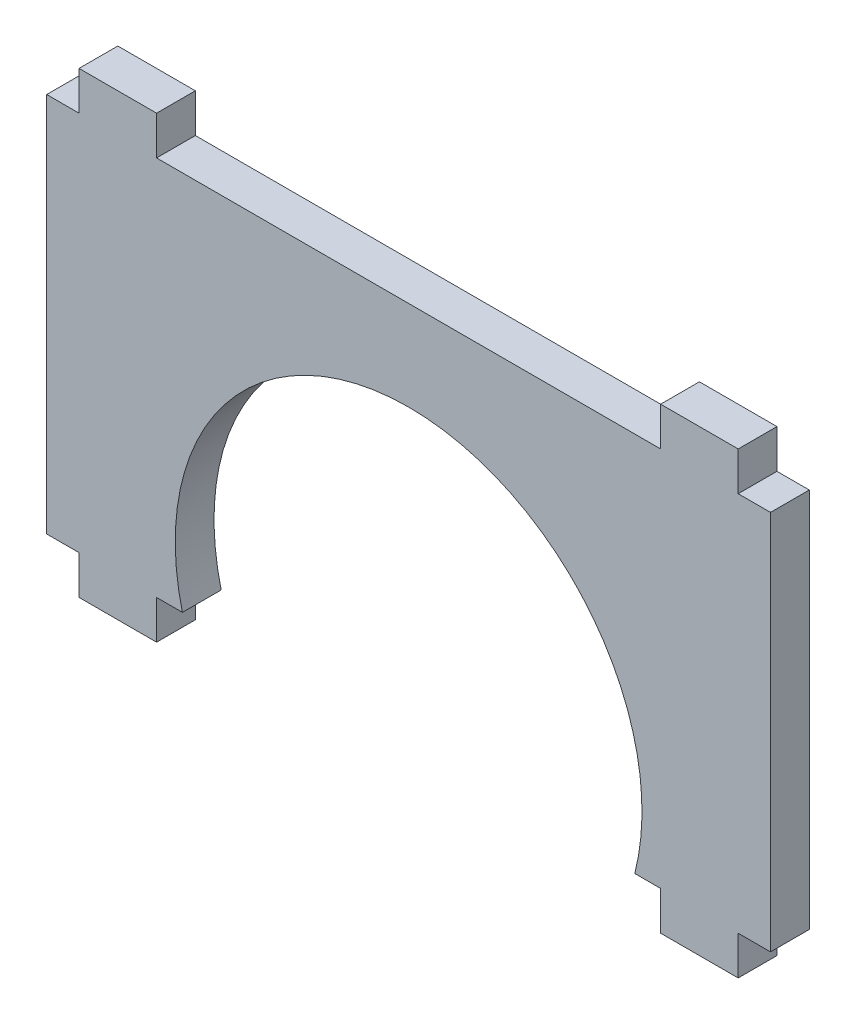
ISO-10303-21;
HEADER;
FILE_DESCRIPTION(('STEP AP214'),'2;1');
FILE_NAME('part.step','',(''),(''),'','','');
FILE_SCHEMA(('AUTOMOTIVE_DESIGN { 1 0 10303 214 1 1 1 1 }'));
ENDSEC;
DATA;
#1=APPLICATION_CONTEXT('core data for automotive mechanical design processes');
#2=APPLICATION_PROTOCOL_DEFINITION('international standard','automotive_design',2000,#1);
#3=PRODUCT_CONTEXT('',#1,'mechanical');
#4=PRODUCT('Part','Part','',(#3));
#5=PRODUCT_RELATED_PRODUCT_CATEGORY('part','',(#4));
#6=PRODUCT_DEFINITION_FORMATION('','',#4);
#7=PRODUCT_DEFINITION_CONTEXT('part definition',#1,'design');
#8=PRODUCT_DEFINITION('design','',#6,#7);
#9=PRODUCT_DEFINITION_SHAPE('','',#8);
#10=(LENGTH_UNIT() NAMED_UNIT(*) SI_UNIT(.MILLI.,.METRE.));
#11=(NAMED_UNIT(*) PLANE_ANGLE_UNIT() SI_UNIT($,.RADIAN.));
#12=(NAMED_UNIT(*) SI_UNIT($,.STERADIAN.) SOLID_ANGLE_UNIT());
#13=UNCERTAINTY_MEASURE_WITH_UNIT(LENGTH_MEASURE(1.E-05),#10,'distance_accuracy_value','');
#14=(GEOMETRIC_REPRESENTATION_CONTEXT(3) GLOBAL_UNCERTAINTY_ASSIGNED_CONTEXT((#13)) GLOBAL_UNIT_ASSIGNED_CONTEXT((#10,
#11,#12)) REPRESENTATION_CONTEXT('',''));
#15=CARTESIAN_POINT('',(0.,0.,0.));
#16=DIRECTION('',(0.,0.,1.));
#17=DIRECTION('',(1.,0.,0.));
#18=AXIS2_PLACEMENT_3D('',#15,#16,#17);
#19=CARTESIAN_POINT('',(0.,-14.725,3.));
#20=DIRECTION('',(0.,1.,0.));
#21=DIRECTION('',(-1.,0.,0.));
#22=AXIS2_PLACEMENT_3D('',#19,#20,#21);
#23=PLANE('',#22);
#24=DIRECTION('',(1.,0.,0.));
#25=VECTOR('',#24,1.);
#26=CARTESIAN_POINT('',(0.,-14.725,0.));
#27=LINE('',#26,#25);
#28=CARTESIAN_POINT('',(-28.,-14.725,0.));
#29=VERTEX_POINT('',#28);
#30=CARTESIAN_POINT('',(-25.5,-14.725,0.));
#31=VERTEX_POINT('',#30);
#32=EDGE_CURVE('E339',#29,#31,#27,.T.);
#33=ORIENTED_EDGE('',*,*,#32,.T.);
#34=DIRECTION('',(0.,0.,-1.));
#35=VECTOR('',#34,1.);
#36=CARTESIAN_POINT('',(-25.5,-14.725,3.));
#37=LINE('',#36,#35);
#38=CARTESIAN_POINT('',(-25.5,-14.725,3.));
#39=VERTEX_POINT('',#38);
#40=EDGE_CURVE('E11',#39,#31,#37,.T.);
#41=ORIENTED_EDGE('',*,*,#40,.F.);
#42=DIRECTION('',(1.,0.,0.));
#43=VECTOR('',#42,1.);
#44=CARTESIAN_POINT('',(0.,-14.725,3.));
#45=LINE('',#44,#43);
#46=CARTESIAN_POINT('',(-28.,-14.725,3.));
#47=VERTEX_POINT('',#46);
#48=EDGE_CURVE('E261',#47,#39,#45,.T.);
#49=ORIENTED_EDGE('',*,*,#48,.F.);
#50=DIRECTION('',(0.,0.,-1.));
#51=VECTOR('',#50,1.);
#52=CARTESIAN_POINT('',(-28.,-14.725,3.));
#53=LINE('',#52,#51);
#54=EDGE_CURVE('E58',#47,#29,#53,.T.);
#55=ORIENTED_EDGE('',*,*,#54,.T.);
#56=EDGE_LOOP('',(#33,#41,#49,#55));
#57=FACE_BOUND('',#56,.T.);
#58=ADVANCED_FACE('F41',(#57),#23,.F.);
#59=CARTESIAN_POINT('',(-25.5,0.,3.));
#60=DIRECTION('',(1.,0.,0.));
#61=DIRECTION('',(0.,1.,0.));
#62=AXIS2_PLACEMENT_3D('',#59,#60,#61);
#63=PLANE('',#62);
#64=DIRECTION('',(0.,-1.,0.));
#65=VECTOR('',#64,1.);
#66=CARTESIAN_POINT('',(-25.5,0.,0.));
#67=LINE('',#66,#65);
#68=CARTESIAN_POINT('',(-25.5,-17.725,0.));
#69=VERTEX_POINT('',#68);
#70=EDGE_CURVE('E334',#31,#69,#67,.T.);
#71=ORIENTED_EDGE('',*,*,#70,.T.);
#72=DIRECTION('',(0.,0.,-1.));
#73=VECTOR('',#72,1.);
#74=CARTESIAN_POINT('',(-25.5,-17.725,3.));
#75=LINE('',#74,#73);
#76=CARTESIAN_POINT('',(-25.5,-17.725,3.));
#77=VERTEX_POINT('',#76);
#78=EDGE_CURVE('E50',#77,#69,#75,.T.);
#79=ORIENTED_EDGE('',*,*,#78,.F.);
#80=DIRECTION('',(0.,-1.,0.));
#81=VECTOR('',#80,1.);
#82=CARTESIAN_POINT('',(-25.5,0.,3.));
#83=LINE('',#82,#81);
#84=EDGE_CURVE('E138',#39,#77,#83,.T.);
#85=ORIENTED_EDGE('',*,*,#84,.F.);
#86=ORIENTED_EDGE('',*,*,#40,.T.);
#87=EDGE_LOOP('',(#71,#79,#85,#86));
#88=FACE_BOUND('',#87,.T.);
#89=ADVANCED_FACE('F43',(#88),#63,.F.);
#90=CARTESIAN_POINT('',(0.,-17.725,3.));
#91=DIRECTION('',(0.,1.,0.));
#92=DIRECTION('',(-1.,0.,0.));
#93=AXIS2_PLACEMENT_3D('',#90,#91,#92);
#94=PLANE('',#93);
#95=DIRECTION('',(1.,0.,0.));
#96=VECTOR('',#95,1.);
#97=CARTESIAN_POINT('',(0.,-17.725,0.));
#98=LINE('',#97,#96);
#99=CARTESIAN_POINT('',(-19.5,-17.725,0.));
#100=VERTEX_POINT('',#99);
#101=EDGE_CURVE('E330',#69,#100,#98,.T.);
#102=ORIENTED_EDGE('',*,*,#101,.T.);
#103=DIRECTION('',(0.,0.,-1.));
#104=VECTOR('',#103,1.);
#105=CARTESIAN_POINT('',(-19.5,-17.725,3.));
#106=LINE('',#105,#104);
#107=CARTESIAN_POINT('',(-19.5,-17.725,3.));
#108=VERTEX_POINT('',#107);
#109=EDGE_CURVE('E322',#108,#100,#106,.T.);
#110=ORIENTED_EDGE('',*,*,#109,.F.);
#111=DIRECTION('',(1.,0.,0.));
#112=VECTOR('',#111,1.);
#113=CARTESIAN_POINT('',(0.,-17.725,3.));
#114=LINE('',#113,#112);
#115=EDGE_CURVE('E258',#77,#108,#114,.T.);
#116=ORIENTED_EDGE('',*,*,#115,.F.);
#117=ORIENTED_EDGE('',*,*,#78,.T.);
#118=EDGE_LOOP('',(#102,#110,#116,#117));
#119=FACE_BOUND('',#118,.T.);
#120=ADVANCED_FACE('F328',(#119),#94,.F.);
#121=CARTESIAN_POINT('',(-19.5,0.,3.));
#122=DIRECTION('',(1.,0.,0.));
#123=DIRECTION('',(0.,0.,-1.));
#124=AXIS2_PLACEMENT_3D('',#121,#122,#123);
#125=PLANE('',#124);
#126=DIRECTION('',(0.,-1.,0.));
#127=VECTOR('',#126,1.);
#128=CARTESIAN_POINT('',(-19.5,0.,0.));
#129=LINE('',#128,#127);
#130=CARTESIAN_POINT('',(-19.5,-14.725,0.));
#131=VERTEX_POINT('',#130);
#132=EDGE_CURVE('E336',#131,#100,#129,.T.);
#133=ORIENTED_EDGE('',*,*,#132,.F.);
#134=DIRECTION('',(0.,0.,-1.));
#135=VECTOR('',#134,1.);
#136=CARTESIAN_POINT('',(-19.5,-14.725,3.));
#137=LINE('',#136,#135);
#138=CARTESIAN_POINT('',(-19.5,-14.725,3.));
#139=VERTEX_POINT('',#138);
#140=EDGE_CURVE('E280',#139,#131,#137,.T.);
#141=ORIENTED_EDGE('',*,*,#140,.F.);
#142=DIRECTION('',(0.,-1.,0.));
#143=VECTOR('',#142,1.);
#144=CARTESIAN_POINT('',(-19.5,0.,3.));
#145=LINE('',#144,#143);
#146=EDGE_CURVE('E255',#139,#108,#145,.T.);
#147=ORIENTED_EDGE('',*,*,#146,.T.);
#148=ORIENTED_EDGE('',*,*,#109,.T.);
#149=EDGE_LOOP('',(#133,#141,#147,#148));
#150=FACE_BOUND('',#149,.T.);
#151=ADVANCED_FACE('F413',(#150),#125,.T.);
#152=CARTESIAN_POINT('',(-17.5,-14.725,0.));
#153=VERTEX_POINT('',#152);
#154=EDGE_CURVE('E277',#131,#153,#27,.T.);
#155=ORIENTED_EDGE('',*,*,#154,.T.);
#156=DIRECTION('',(0.,0.,-1.));
#157=VECTOR('',#156,1.);
#158=CARTESIAN_POINT('',(-17.5,-14.725,3.));
#159=LINE('',#158,#157);
#160=CARTESIAN_POINT('',(-17.5,-14.725,3.));
#161=VERTEX_POINT('',#160);
#162=EDGE_CURVE('E274',#161,#153,#159,.T.);
#163=ORIENTED_EDGE('',*,*,#162,.F.);
#164=EDGE_CURVE('E254',#139,#161,#45,.T.);
#165=ORIENTED_EDGE('',*,*,#164,.F.);
#166=ORIENTED_EDGE('',*,*,#140,.T.);
#167=EDGE_LOOP('',(#155,#163,#165,#166));
#168=FACE_BOUND('',#167,.T.);
#169=ADVANCED_FACE('F275',(#168),#23,.F.);
#170=CARTESIAN_POINT('',(0.,-10.275,3.));
#171=DIRECTION('',(0.,0.,-1.));
#172=DIRECTION('',(-1.,0.,0.));
#173=AXIS2_PLACEMENT_3D('',#170,#171,#172);
#174=CYLINDRICAL_SURFACE('',#173,18.0569238797753);
#175=CARTESIAN_POINT('',(0.,-10.275,0.));
#176=DIRECTION('',(0.,0.,1.));
#177=DIRECTION('',(1.,0.,0.));
#178=AXIS2_PLACEMENT_3D('',#175,#176,#177);
#179=CIRCLE('',#178,18.0569238797753);
#180=CARTESIAN_POINT('',(17.5,-14.725,0.));
#181=VERTEX_POINT('',#180);
#182=EDGE_CURVE('E286',#153,#181,#179,.F.);
#183=ORIENTED_EDGE('',*,*,#182,.T.);
#184=DIRECTION('',(0.,0.,-1.));
#185=VECTOR('',#184,1.);
#186=CARTESIAN_POINT('',(17.5,-14.725,3.));
#187=LINE('',#186,#185);
#188=CARTESIAN_POINT('',(17.5,-14.725,3.));
#189=VERTEX_POINT('',#188);
#190=EDGE_CURVE('E281',#189,#181,#187,.T.);
#191=ORIENTED_EDGE('',*,*,#190,.F.);
#192=CARTESIAN_POINT('',(0.,-10.275,3.));
#193=DIRECTION('',(0.,0.,1.));
#194=DIRECTION('',(1.,0.,0.));
#195=AXIS2_PLACEMENT_3D('',#192,#193,#194);
#196=CIRCLE('',#195,18.0569238797753);
#197=EDGE_CURVE('E252',#161,#189,#196,.F.);
#198=ORIENTED_EDGE('',*,*,#197,.F.);
#199=ORIENTED_EDGE('',*,*,#162,.T.);
#200=EDGE_LOOP('',(#183,#191,#198,#199));
#201=FACE_BOUND('',#200,.T.);
#202=ADVANCED_FACE('F283',(#201),#174,.F.);
#203=CARTESIAN_POINT('',(0.,-14.725,3.));
#204=DIRECTION('',(0.,1.,0.));
#205=DIRECTION('',(-1.,0.,0.));
#206=AXIS2_PLACEMENT_3D('',#203,#204,#205);
#207=PLANE('',#206);
#208=DIRECTION('',(1.,0.,0.));
#209=VECTOR('',#208,1.);
#210=CARTESIAN_POINT('',(0.,-14.725,0.));
#211=LINE('',#210,#209);
#212=CARTESIAN_POINT('',(19.5,-14.725,0.));
#213=VERTEX_POINT('',#212);
#214=EDGE_CURVE('E344',#181,#213,#211,.T.);
#215=ORIENTED_EDGE('',*,*,#214,.T.);
#216=DIRECTION('',(0.,0.,-1.));
#217=VECTOR('',#216,1.);
#218=CARTESIAN_POINT('',(19.5,-14.725,3.));
#219=LINE('',#218,#217);
#220=CARTESIAN_POINT('',(19.5,-14.725,3.));
#221=VERTEX_POINT('',#220);
#222=EDGE_CURVE('E289',#221,#213,#219,.T.);
#223=ORIENTED_EDGE('',*,*,#222,.F.);
#224=DIRECTION('',(1.,0.,0.));
#225=VECTOR('',#224,1.);
#226=CARTESIAN_POINT('',(0.,-14.725,3.));
#227=LINE('',#226,#225);
#228=EDGE_CURVE('E250',#189,#221,#227,.T.);
#229=ORIENTED_EDGE('',*,*,#228,.F.);
#230=ORIENTED_EDGE('',*,*,#190,.T.);
#231=EDGE_LOOP('',(#215,#223,#229,#230));
#232=FACE_BOUND('',#231,.T.);
#233=ADVANCED_FACE('F292',(#232),#207,.F.);
#234=CARTESIAN_POINT('',(19.5,0.,3.));
#235=DIRECTION('',(1.,0.,0.));
#236=DIRECTION('',(0.,0.,-1.));
#237=AXIS2_PLACEMENT_3D('',#234,#235,#236);
#238=PLANE('',#237);
#239=DIRECTION('',(0.,-1.,0.));
#240=VECTOR('',#239,1.);
#241=CARTESIAN_POINT('',(19.5,0.,0.));
#242=LINE('',#241,#240);
#243=CARTESIAN_POINT('',(19.5,-17.725,0.));
#244=VERTEX_POINT('',#243);
#245=EDGE_CURVE('E303',#213,#244,#242,.T.);
#246=ORIENTED_EDGE('',*,*,#245,.T.);
#247=DIRECTION('',(0.,0.,-1.));
#248=VECTOR('',#247,1.);
#249=CARTESIAN_POINT('',(19.5,-17.725,3.));
#250=LINE('',#249,#248);
#251=CARTESIAN_POINT('',(19.5,-17.725,3.));
#252=VERTEX_POINT('',#251);
#253=EDGE_CURVE('E300',#252,#244,#250,.T.);
#254=ORIENTED_EDGE('',*,*,#253,.F.);
#255=DIRECTION('',(0.,-1.,0.));
#256=VECTOR('',#255,1.);
#257=CARTESIAN_POINT('',(19.5,0.,3.));
#258=LINE('',#257,#256);
#259=EDGE_CURVE('E248',#221,#252,#258,.T.);
#260=ORIENTED_EDGE('',*,*,#259,.F.);
#261=ORIENTED_EDGE('',*,*,#222,.T.);
#262=EDGE_LOOP('',(#246,#254,#260,#261));
#263=FACE_BOUND('',#262,.T.);
#264=ADVANCED_FACE('F301',(#263),#238,.F.);
#265=CARTESIAN_POINT('',(0.,-17.725,3.));
#266=DIRECTION('',(0.,-1.,0.));
#267=DIRECTION('',(1.,0.,0.));
#268=AXIS2_PLACEMENT_3D('',#265,#266,#267);
#269=PLANE('',#268);
#270=DIRECTION('',(-1.,0.,0.));
#271=VECTOR('',#270,1.);
#272=CARTESIAN_POINT('',(0.,-17.725,0.));
#273=LINE('',#272,#271);
#274=CARTESIAN_POINT('',(25.5,-17.725,0.));
#275=VERTEX_POINT('',#274);
#276=EDGE_CURVE('E310',#275,#244,#273,.T.);
#277=ORIENTED_EDGE('',*,*,#276,.F.);
#278=DIRECTION('',(0.,0.,-1.));
#279=VECTOR('',#278,1.);
#280=CARTESIAN_POINT('',(25.5,-17.725,3.));
#281=LINE('',#280,#279);
#282=CARTESIAN_POINT('',(25.5,-17.725,3.));
#283=VERTEX_POINT('',#282);
#284=EDGE_CURVE('E307',#283,#275,#281,.T.);
#285=ORIENTED_EDGE('',*,*,#284,.F.);
#286=DIRECTION('',(-1.,0.,0.));
#287=VECTOR('',#286,1.);
#288=CARTESIAN_POINT('',(0.,-17.725,3.));
#289=LINE('',#288,#287);
#290=EDGE_CURVE('E245',#283,#252,#289,.T.);
#291=ORIENTED_EDGE('',*,*,#290,.T.);
#292=ORIENTED_EDGE('',*,*,#253,.T.);
#293=EDGE_LOOP('',(#277,#285,#291,#292));
#294=FACE_BOUND('',#293,.T.);
#295=ADVANCED_FACE('F309',(#294),#269,.T.);
#296=CARTESIAN_POINT('',(25.5,0.,3.));
#297=DIRECTION('',(1.,0.,0.));
#298=DIRECTION('',(0.,1.,0.));
#299=AXIS2_PLACEMENT_3D('',#296,#297,#298);
#300=PLANE('',#299);
#301=DIRECTION('',(0.,-1.,0.));
#302=VECTOR('',#301,1.);
#303=CARTESIAN_POINT('',(25.5,0.,0.));
#304=LINE('',#303,#302);
#305=CARTESIAN_POINT('',(25.5,-14.725,0.));
#306=VERTEX_POINT('',#305);
#307=EDGE_CURVE('E349',#306,#275,#304,.T.);
#308=ORIENTED_EDGE('',*,*,#307,.F.);
#309=DIRECTION('',(0.,0.,-1.));
#310=VECTOR('',#309,1.);
#311=CARTESIAN_POINT('',(25.5,-14.725,3.));
#312=LINE('',#311,#310);
#313=CARTESIAN_POINT('',(25.5,-14.725,3.));
#314=VERTEX_POINT('',#313);
#315=EDGE_CURVE('E314',#314,#306,#312,.T.);
#316=ORIENTED_EDGE('',*,*,#315,.F.);
#317=DIRECTION('',(0.,-1.,0.));
#318=VECTOR('',#317,1.);
#319=CARTESIAN_POINT('',(25.5,0.,3.));
#320=LINE('',#319,#318);
#321=EDGE_CURVE('E242',#314,#283,#320,.T.);
#322=ORIENTED_EDGE('',*,*,#321,.T.);
#323=ORIENTED_EDGE('',*,*,#284,.T.);
#324=EDGE_LOOP('',(#308,#316,#322,#323));
#325=FACE_BOUND('',#324,.T.);
#326=ADVANCED_FACE('F411',(#325),#300,.T.);
#327=CARTESIAN_POINT('',(28.,-14.725,0.));
#328=VERTEX_POINT('',#327);
#329=EDGE_CURVE('E346',#306,#328,#211,.T.);
#330=ORIENTED_EDGE('',*,*,#329,.T.);
#331=DIRECTION('',(0.,0.,-1.));
#332=VECTOR('',#331,1.);
#333=CARTESIAN_POINT('',(28.,-14.725,3.));
#334=LINE('',#333,#332);
#335=CARTESIAN_POINT('',(28.,-14.725,3.));
#336=VERTEX_POINT('',#335);
#337=EDGE_CURVE('E316',#336,#328,#334,.T.);
#338=ORIENTED_EDGE('',*,*,#337,.F.);
#339=EDGE_CURVE('E241',#314,#336,#227,.T.);
#340=ORIENTED_EDGE('',*,*,#339,.F.);
#341=ORIENTED_EDGE('',*,*,#315,.T.);
#342=EDGE_LOOP('',(#330,#338,#340,#341));
#343=FACE_BOUND('',#342,.T.);
#344=ADVANCED_FACE('F410',(#343),#207,.F.);
#345=CARTESIAN_POINT('',(28.,0.,3.));
#346=DIRECTION('',(-1.,0.,0.));
#347=DIRECTION('',(0.,0.,1.));
#348=AXIS2_PLACEMENT_3D('',#345,#346,#347);
#349=PLANE('',#348);
#350=DIRECTION('',(0.,1.,0.));
#351=VECTOR('',#350,1.);
#352=CARTESIAN_POINT('',(28.,0.,0.));
#353=LINE('',#352,#351);
#354=CARTESIAN_POINT('',(28.,14.725,0.));
#355=VERTEX_POINT('',#354);
#356=EDGE_CURVE('E351',#328,#355,#353,.T.);
#357=ORIENTED_EDGE('',*,*,#356,.T.);
#358=DIRECTION('',(0.,0.,-1.));
#359=VECTOR('',#358,1.);
#360=CARTESIAN_POINT('',(28.,14.725,3.));
#361=LINE('',#360,#359);
#362=CARTESIAN_POINT('',(28.,14.725,3.));
#363=VERTEX_POINT('',#362);
#364=EDGE_CURVE('E391',#363,#355,#361,.T.);
#365=ORIENTED_EDGE('',*,*,#364,.F.);
#366=DIRECTION('',(0.,1.,0.));
#367=VECTOR('',#366,1.);
#368=CARTESIAN_POINT('',(28.,0.,3.));
#369=LINE('',#368,#367);
#370=EDGE_CURVE('E239',#336,#363,#369,.T.);
#371=ORIENTED_EDGE('',*,*,#370,.F.);
#372=ORIENTED_EDGE('',*,*,#337,.T.);
#373=EDGE_LOOP('',(#357,#365,#371,#372));
#374=FACE_BOUND('',#373,.T.);
#375=ADVANCED_FACE('F397',(#374),#349,.F.);
#376=CARTESIAN_POINT('',(0.,14.725,3.));
#377=DIRECTION('',(0.,1.,0.));
#378=DIRECTION('',(-1.,0.,0.));
#379=AXIS2_PLACEMENT_3D('',#376,#377,#378);
#380=PLANE('',#379);
#381=DIRECTION('',(1.,0.,0.));
#382=VECTOR('',#381,1.);
#383=CARTESIAN_POINT('',(0.,14.725,0.));
#384=LINE('',#383,#382);
#385=CARTESIAN_POINT('',(25.5,14.725,0.));
#386=VERTEX_POINT('',#385);
#387=EDGE_CURVE('E354',#386,#355,#384,.T.);
#388=ORIENTED_EDGE('',*,*,#387,.F.);
#389=DIRECTION('',(0.,0.,-1.));
#390=VECTOR('',#389,1.);
#391=CARTESIAN_POINT('',(25.5,14.725,3.));
#392=LINE('',#391,#390);
#393=CARTESIAN_POINT('',(25.5,14.725,3.));
#394=VERTEX_POINT('',#393);
#395=EDGE_CURVE('E389',#394,#386,#392,.T.);
#396=ORIENTED_EDGE('',*,*,#395,.F.);
#397=DIRECTION('',(1.,0.,0.));
#398=VECTOR('',#397,1.);
#399=CARTESIAN_POINT('',(0.,14.725,3.));
#400=LINE('',#399,#398);
#401=EDGE_CURVE('E236',#394,#363,#400,.T.);
#402=ORIENTED_EDGE('',*,*,#401,.T.);
#403=ORIENTED_EDGE('',*,*,#364,.T.);
#404=EDGE_LOOP('',(#388,#396,#402,#403));
#405=FACE_BOUND('',#404,.T.);
#406=ADVANCED_FACE('F406',(#405),#380,.T.);
#407=CARTESIAN_POINT('',(25.5,0.,3.));
#408=DIRECTION('',(-1.,0.,0.));
#409=DIRECTION('',(0.,-1.,0.));
#410=AXIS2_PLACEMENT_3D('',#407,#408,#409);
#411=PLANE('',#410);
#412=DIRECTION('',(0.,1.,0.));
#413=VECTOR('',#412,1.);
#414=CARTESIAN_POINT('',(25.5,0.,0.));
#415=LINE('',#414,#413);
#416=CARTESIAN_POINT('',(25.5,17.725,0.));
#417=VERTEX_POINT('',#416);
#418=EDGE_CURVE('E357',#386,#417,#415,.T.);
#419=ORIENTED_EDGE('',*,*,#418,.T.);
#420=DIRECTION('',(0.,0.,-1.));
#421=VECTOR('',#420,1.);
#422=CARTESIAN_POINT('',(25.5,17.725,3.));
#423=LINE('',#422,#421);
#424=CARTESIAN_POINT('',(25.5,17.725,3.));
#425=VERTEX_POINT('',#424);
#426=EDGE_CURVE('E386',#425,#417,#423,.T.);
#427=ORIENTED_EDGE('',*,*,#426,.F.);
#428=DIRECTION('',(0.,1.,0.));
#429=VECTOR('',#428,1.);
#430=CARTESIAN_POINT('',(25.5,0.,3.));
#431=LINE('',#430,#429);
#432=EDGE_CURVE('E232',#394,#425,#431,.T.);
#433=ORIENTED_EDGE('',*,*,#432,.F.);
#434=ORIENTED_EDGE('',*,*,#395,.T.);
#435=EDGE_LOOP('',(#419,#427,#433,#434));
#436=FACE_BOUND('',#435,.T.);
#437=ADVANCED_FACE('F440',(#436),#411,.F.);
#438=CARTESIAN_POINT('',(0.,17.725,3.));
#439=DIRECTION('',(0.,-1.,0.));
#440=DIRECTION('',(1.,0.,0.));
#441=AXIS2_PLACEMENT_3D('',#438,#439,#440);
#442=PLANE('',#441);
#443=DIRECTION('',(-1.,0.,0.));
#444=VECTOR('',#443,1.);
#445=CARTESIAN_POINT('',(0.,17.725,0.));
#446=LINE('',#445,#444);
#447=CARTESIAN_POINT('',(19.5,17.725,0.));
#448=VERTEX_POINT('',#447);
#449=EDGE_CURVE('E359',#417,#448,#446,.T.);
#450=ORIENTED_EDGE('',*,*,#449,.T.);
#451=DIRECTION('',(0.,0.,-1.));
#452=VECTOR('',#451,1.);
#453=CARTESIAN_POINT('',(19.5,17.725,3.));
#454=LINE('',#453,#452);
#455=CARTESIAN_POINT('',(19.5,17.725,3.));
#456=VERTEX_POINT('',#455);
#457=EDGE_CURVE('E384',#456,#448,#454,.T.);
#458=ORIENTED_EDGE('',*,*,#457,.F.);
#459=DIRECTION('',(-1.,0.,0.));
#460=VECTOR('',#459,1.);
#461=CARTESIAN_POINT('',(0.,17.725,3.));
#462=LINE('',#461,#460);
#463=EDGE_CURVE('E229',#425,#456,#462,.T.);
#464=ORIENTED_EDGE('',*,*,#463,.F.);
#465=ORIENTED_EDGE('',*,*,#426,.T.);
#466=EDGE_LOOP('',(#450,#458,#464,#465));
#467=FACE_BOUND('',#466,.T.);
#468=ADVANCED_FACE('F443',(#467),#442,.F.);
#469=CARTESIAN_POINT('',(19.5,0.,3.));
#470=DIRECTION('',(-1.,0.,0.));
#471=DIRECTION('',(0.,0.,1.));
#472=AXIS2_PLACEMENT_3D('',#469,#470,#471);
#473=PLANE('',#472);
#474=DIRECTION('',(0.,1.,0.));
#475=VECTOR('',#474,1.);
#476=CARTESIAN_POINT('',(19.5,0.,0.));
#477=LINE('',#476,#475);
#478=CARTESIAN_POINT('',(19.5,14.725,0.));
#479=VERTEX_POINT('',#478);
#480=EDGE_CURVE('E362',#479,#448,#477,.T.);
#481=ORIENTED_EDGE('',*,*,#480,.F.);
#482=DIRECTION('',(0.,0.,-1.));
#483=VECTOR('',#482,1.);
#484=CARTESIAN_POINT('',(19.5,14.725,3.));
#485=LINE('',#484,#483);
#486=CARTESIAN_POINT('',(19.5,14.725,3.));
#487=VERTEX_POINT('',#486);
#488=EDGE_CURVE('E382',#487,#479,#485,.T.);
#489=ORIENTED_EDGE('',*,*,#488,.F.);
#490=DIRECTION('',(0.,1.,0.));
#491=VECTOR('',#490,1.);
#492=CARTESIAN_POINT('',(19.5,0.,3.));
#493=LINE('',#492,#491);
#494=EDGE_CURVE('E225',#487,#456,#493,.T.);
#495=ORIENTED_EDGE('',*,*,#494,.T.);
#496=ORIENTED_EDGE('',*,*,#457,.T.);
#497=EDGE_LOOP('',(#481,#489,#495,#496));
#498=FACE_BOUND('',#497,.T.);
#499=ADVANCED_FACE('F447',(#498),#473,.T.);
#500=CARTESIAN_POINT('',(0.,14.725,3.));
#501=DIRECTION('',(0.,1.,0.));
#502=DIRECTION('',(-1.,0.,0.));
#503=AXIS2_PLACEMENT_3D('',#500,#501,#502);
#504=PLANE('',#503);
#505=DIRECTION('',(1.,0.,0.));
#506=VECTOR('',#505,1.);
#507=CARTESIAN_POINT('',(0.,14.725,0.));
#508=LINE('',#507,#506);
#509=CARTESIAN_POINT('',(-19.5,14.725,0.));
#510=VERTEX_POINT('',#509);
#511=EDGE_CURVE('E365',#510,#479,#508,.T.);
#512=ORIENTED_EDGE('',*,*,#511,.F.);
#513=DIRECTION('',(0.,0.,-1.));
#514=VECTOR('',#513,1.);
#515=CARTESIAN_POINT('',(-19.5,14.725,3.));
#516=LINE('',#515,#514);
#517=CARTESIAN_POINT('',(-19.5,14.725,3.));
#518=VERTEX_POINT('',#517);
#519=EDGE_CURVE('E380',#518,#510,#516,.T.);
#520=ORIENTED_EDGE('',*,*,#519,.F.);
#521=DIRECTION('',(1.,0.,0.));
#522=VECTOR('',#521,1.);
#523=CARTESIAN_POINT('',(0.,14.725,3.));
#524=LINE('',#523,#522);
#525=EDGE_CURVE('E219',#518,#487,#524,.T.);
#526=ORIENTED_EDGE('',*,*,#525,.T.);
#527=ORIENTED_EDGE('',*,*,#488,.T.);
#528=EDGE_LOOP('',(#512,#520,#526,#527));
#529=FACE_BOUND('',#528,.T.);
#530=ADVANCED_FACE('F451',(#529),#504,.T.);
#531=CARTESIAN_POINT('',(-19.5,0.,3.));
#532=DIRECTION('',(-1.,0.,0.));
#533=DIRECTION('',(0.,0.,1.));
#534=AXIS2_PLACEMENT_3D('',#531,#532,#533);
#535=PLANE('',#534);
#536=DIRECTION('',(0.,1.,0.));
#537=VECTOR('',#536,1.);
#538=CARTESIAN_POINT('',(-19.5,0.,0.));
#539=LINE('',#538,#537);
#540=CARTESIAN_POINT('',(-19.5,17.725,0.));
#541=VERTEX_POINT('',#540);
#542=EDGE_CURVE('E368',#510,#541,#539,.T.);
#543=ORIENTED_EDGE('',*,*,#542,.T.);
#544=DIRECTION('',(0.,0.,-1.));
#545=VECTOR('',#544,1.);
#546=CARTESIAN_POINT('',(-19.5,17.725,3.));
#547=LINE('',#546,#545);
#548=CARTESIAN_POINT('',(-19.5,17.725,3.));
#549=VERTEX_POINT('',#548);
#550=EDGE_CURVE('E378',#549,#541,#547,.T.);
#551=ORIENTED_EDGE('',*,*,#550,.F.);
#552=DIRECTION('',(0.,1.,0.));
#553=VECTOR('',#552,1.);
#554=CARTESIAN_POINT('',(-19.5,0.,3.));
#555=LINE('',#554,#553);
#556=EDGE_CURVE('E224',#518,#549,#555,.T.);
#557=ORIENTED_EDGE('',*,*,#556,.F.);
#558=ORIENTED_EDGE('',*,*,#519,.T.);
#559=EDGE_LOOP('',(#543,#551,#557,#558));
#560=FACE_BOUND('',#559,.T.);
#561=ADVANCED_FACE('F452',(#560),#535,.F.);
#562=CARTESIAN_POINT('',(0.,17.725,3.));
#563=DIRECTION('',(0.,1.,0.));
#564=DIRECTION('',(-1.,0.,0.));
#565=AXIS2_PLACEMENT_3D('',#562,#563,#564);
#566=PLANE('',#565);
#567=DIRECTION('',(1.,0.,0.));
#568=VECTOR('',#567,1.);
#569=CARTESIAN_POINT('',(0.,17.725,0.));
#570=LINE('',#569,#568);
#571=CARTESIAN_POINT('',(-25.5,17.725,0.));
#572=VERTEX_POINT('',#571);
#573=EDGE_CURVE('E371',#572,#541,#570,.T.);
#574=ORIENTED_EDGE('',*,*,#573,.F.);
#575=DIRECTION('',(0.,0.,-1.));
#576=VECTOR('',#575,1.);
#577=CARTESIAN_POINT('',(-25.5,17.725,3.));
#578=LINE('',#577,#576);
#579=CARTESIAN_POINT('',(-25.5,17.725,3.));
#580=VERTEX_POINT('',#579);
#581=EDGE_CURVE('E205',#580,#572,#578,.T.);
#582=ORIENTED_EDGE('',*,*,#581,.F.);
#583=DIRECTION('',(1.,0.,0.));
#584=VECTOR('',#583,1.);
#585=CARTESIAN_POINT('',(0.,17.725,3.));
#586=LINE('',#585,#584);
#587=EDGE_CURVE('E214',#580,#549,#586,.T.);
#588=ORIENTED_EDGE('',*,*,#587,.T.);
#589=ORIENTED_EDGE('',*,*,#550,.T.);
#590=EDGE_LOOP('',(#574,#582,#588,#589));
#591=FACE_BOUND('',#590,.T.);
#592=ADVANCED_FACE('F455',(#591),#566,.T.);
#593=CARTESIAN_POINT('',(-25.5,0.,3.));
#594=DIRECTION('',(-1.,0.,0.));
#595=DIRECTION('',(0.,-1.,0.));
#596=AXIS2_PLACEMENT_3D('',#593,#594,#595);
#597=PLANE('',#596);
#598=DIRECTION('',(0.,1.,0.));
#599=VECTOR('',#598,1.);
#600=CARTESIAN_POINT('',(-25.5,0.,0.));
#601=LINE('',#600,#599);
#602=CARTESIAN_POINT('',(-25.5,14.725,0.));
#603=VERTEX_POINT('',#602);
#604=EDGE_CURVE('E201',#603,#572,#601,.T.);
#605=ORIENTED_EDGE('',*,*,#604,.F.);
#606=DIRECTION('',(0.,0.,-1.));
#607=VECTOR('',#606,1.);
#608=CARTESIAN_POINT('',(-25.5,14.725,3.));
#609=LINE('',#608,#607);
#610=CARTESIAN_POINT('',(-25.5,14.725,3.));
#611=VERTEX_POINT('',#610);
#612=EDGE_CURVE('E196',#611,#603,#609,.T.);
#613=ORIENTED_EDGE('',*,*,#612,.F.);
#614=DIRECTION('',(0.,1.,0.));
#615=VECTOR('',#614,1.);
#616=CARTESIAN_POINT('',(-25.5,0.,3.));
#617=LINE('',#616,#615);
#618=EDGE_CURVE('E199',#611,#580,#617,.T.);
#619=ORIENTED_EDGE('',*,*,#618,.T.);
#620=ORIENTED_EDGE('',*,*,#581,.T.);
#621=EDGE_LOOP('',(#605,#613,#619,#620));
#622=FACE_BOUND('',#621,.T.);
#623=ADVANCED_FACE('F198',(#622),#597,.T.);
#624=CARTESIAN_POINT('',(-28.,14.725,0.));
#625=VERTEX_POINT('',#624);
#626=EDGE_CURVE('E265',#625,#603,#508,.T.);
#627=ORIENTED_EDGE('',*,*,#626,.F.);
#628=DIRECTION('',(0.,0.,-1.));
#629=VECTOR('',#628,1.);
#630=CARTESIAN_POINT('',(-28.,14.725,3.));
#631=LINE('',#630,#629);
#632=CARTESIAN_POINT('',(-28.,14.725,3.));
#633=VERTEX_POINT('',#632);
#634=EDGE_CURVE('E126',#633,#625,#631,.T.);
#635=ORIENTED_EDGE('',*,*,#634,.F.);
#636=EDGE_CURVE('E212',#633,#611,#524,.T.);
#637=ORIENTED_EDGE('',*,*,#636,.T.);
#638=ORIENTED_EDGE('',*,*,#612,.T.);
#639=EDGE_LOOP('',(#627,#635,#637,#638));
#640=FACE_BOUND('',#639,.T.);
#641=ADVANCED_FACE('F216',(#640),#504,.T.);
#642=CARTESIAN_POINT('',(-28.,0.,3.));
#643=DIRECTION('',(-1.,0.,0.));
#644=DIRECTION('',(0.,0.,1.));
#645=AXIS2_PLACEMENT_3D('',#642,#643,#644);
#646=PLANE('',#645);
#647=DIRECTION('',(0.,1.,0.));
#648=VECTOR('',#647,1.);
#649=CARTESIAN_POINT('',(-28.,0.,0.));
#650=LINE('',#649,#648);
#651=EDGE_CURVE('E262',#29,#625,#650,.T.);
#652=ORIENTED_EDGE('',*,*,#651,.F.);
#653=ORIENTED_EDGE('',*,*,#54,.F.);
#654=DIRECTION('',(0.,1.,0.));
#655=VECTOR('',#654,1.);
#656=CARTESIAN_POINT('',(-28.,0.,3.));
#657=LINE('',#656,#655);
#658=EDGE_CURVE('E217',#47,#633,#657,.T.);
#659=ORIENTED_EDGE('',*,*,#658,.T.);
#660=ORIENTED_EDGE('',*,*,#634,.T.);
#661=EDGE_LOOP('',(#652,#653,#659,#660));
#662=FACE_BOUND('',#661,.T.);
#663=ADVANCED_FACE('F464',(#662),#646,.T.);
#664=CARTESIAN_POINT('',(0.,0.,3.));
#665=DIRECTION('',(0.,0.,1.));
#666=DIRECTION('',(1.,0.,0.));
#667=AXIS2_PLACEMENT_3D('',#664,#665,#666);
#668=PLANE('',#667);
#669=ORIENTED_EDGE('',*,*,#48,.T.);
#670=ORIENTED_EDGE('',*,*,#84,.T.);
#671=ORIENTED_EDGE('',*,*,#115,.T.);
#672=ORIENTED_EDGE('',*,*,#146,.F.);
#673=ORIENTED_EDGE('',*,*,#164,.T.);
#674=ORIENTED_EDGE('',*,*,#197,.T.);
#675=ORIENTED_EDGE('',*,*,#228,.T.);
#676=ORIENTED_EDGE('',*,*,#259,.T.);
#677=ORIENTED_EDGE('',*,*,#290,.F.);
#678=ORIENTED_EDGE('',*,*,#321,.F.);
#679=ORIENTED_EDGE('',*,*,#339,.T.);
#680=ORIENTED_EDGE('',*,*,#370,.T.);
#681=ORIENTED_EDGE('',*,*,#401,.F.);
#682=ORIENTED_EDGE('',*,*,#432,.T.);
#683=ORIENTED_EDGE('',*,*,#463,.T.);
#684=ORIENTED_EDGE('',*,*,#494,.F.);
#685=ORIENTED_EDGE('',*,*,#525,.F.);
#686=ORIENTED_EDGE('',*,*,#556,.T.);
#687=ORIENTED_EDGE('',*,*,#587,.F.);
#688=ORIENTED_EDGE('',*,*,#618,.F.);
#689=ORIENTED_EDGE('',*,*,#636,.F.);
#690=ORIENTED_EDGE('',*,*,#658,.F.);
#691=EDGE_LOOP('',(#669,#670,#671,#672,#673,#674,#675,#676,#677,#678,#679,#680,#681,#682,#683,
#684,#685,#686,#687,#688,#689,#690));
#692=FACE_BOUND('',#691,.T.);
#693=ADVANCED_FACE('F210',(#692),#668,.T.);
#694=CARTESIAN_POINT('',(0.,0.,0.));
#695=DIRECTION('',(0.,0.,1.));
#696=DIRECTION('',(1.,0.,0.));
#697=AXIS2_PLACEMENT_3D('',#694,#695,#696);
#698=PLANE('',#697);
#699=ORIENTED_EDGE('',*,*,#32,.F.);
#700=ORIENTED_EDGE('',*,*,#651,.T.);
#701=ORIENTED_EDGE('',*,*,#626,.T.);
#702=ORIENTED_EDGE('',*,*,#604,.T.);
#703=ORIENTED_EDGE('',*,*,#573,.T.);
#704=ORIENTED_EDGE('',*,*,#542,.F.);
#705=ORIENTED_EDGE('',*,*,#511,.T.);
#706=ORIENTED_EDGE('',*,*,#480,.T.);
#707=ORIENTED_EDGE('',*,*,#449,.F.);
#708=ORIENTED_EDGE('',*,*,#418,.F.);
#709=ORIENTED_EDGE('',*,*,#387,.T.);
#710=ORIENTED_EDGE('',*,*,#356,.F.);
#711=ORIENTED_EDGE('',*,*,#329,.F.);
#712=ORIENTED_EDGE('',*,*,#307,.T.);
#713=ORIENTED_EDGE('',*,*,#276,.T.);
#714=ORIENTED_EDGE('',*,*,#245,.F.);
#715=ORIENTED_EDGE('',*,*,#214,.F.);
#716=ORIENTED_EDGE('',*,*,#182,.F.);
#717=ORIENTED_EDGE('',*,*,#154,.F.);
#718=ORIENTED_EDGE('',*,*,#132,.T.);
#719=ORIENTED_EDGE('',*,*,#101,.F.);
#720=ORIENTED_EDGE('',*,*,#70,.F.);
#721=EDGE_LOOP('',(#699,#700,#701,#702,#703,#704,#705,#706,#707,#708,#709,#710,#711,#712,#713,
#714,#715,#716,#717,#718,#719,#720));
#722=FACE_BOUND('',#721,.T.);
#723=ADVANCED_FACE('F333',(#722),#698,.F.);
#724=CLOSED_SHELL('',(#58,#89,#120,#151,#169,#202,#233,#264,#295,#326,#344,#375,#406,#437,#468,
#499,#530,#561,#592,#623,#641,#663,#693,#723));
#725=MANIFOLD_SOLID_BREP('B2',#724);
#726=ADVANCED_BREP_SHAPE_REPRESENTATION('',(#18,#725),#14);
#727=SHAPE_DEFINITION_REPRESENTATION(#9,#726);
ENDSEC;
END-ISO-10303-21;
